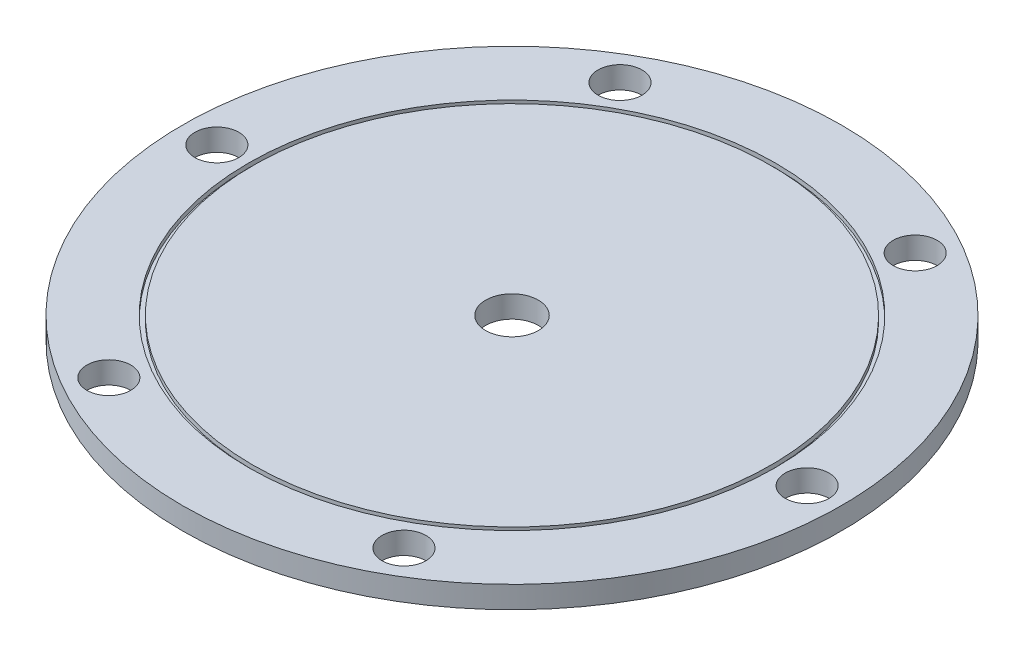
ISO-10303-21;
HEADER;
FILE_DESCRIPTION(('STEP AP214'),'2;1');
FILE_NAME('part.step','',(''),(''),'','','');
FILE_SCHEMA(('AUTOMOTIVE_DESIGN { 1 0 10303 214 1 1 1 1 }'));
ENDSEC;
DATA;
#1=APPLICATION_CONTEXT('core data for automotive mechanical design processes');
#2=APPLICATION_PROTOCOL_DEFINITION('international standard','automotive_design',2000,#1);
#3=PRODUCT_CONTEXT('',#1,'mechanical');
#4=PRODUCT('Part','Part','',(#3));
#5=PRODUCT_RELATED_PRODUCT_CATEGORY('part','',(#4));
#6=PRODUCT_DEFINITION_FORMATION('','',#4);
#7=PRODUCT_DEFINITION_CONTEXT('part definition',#1,'design');
#8=PRODUCT_DEFINITION('design','',#6,#7);
#9=PRODUCT_DEFINITION_SHAPE('','',#8);
#10=(LENGTH_UNIT() NAMED_UNIT(*) SI_UNIT(.MILLI.,.METRE.));
#11=(NAMED_UNIT(*) PLANE_ANGLE_UNIT() SI_UNIT($,.RADIAN.));
#12=(NAMED_UNIT(*) SI_UNIT($,.STERADIAN.) SOLID_ANGLE_UNIT());
#13=UNCERTAINTY_MEASURE_WITH_UNIT(LENGTH_MEASURE(1.E-05),#10,'distance_accuracy_value','');
#14=(GEOMETRIC_REPRESENTATION_CONTEXT(3) GLOBAL_UNCERTAINTY_ASSIGNED_CONTEXT((#13)) GLOBAL_UNIT_ASSIGNED_CONTEXT((#10,
#11,#12)) REPRESENTATION_CONTEXT('',''));
#15=CARTESIAN_POINT('',(0.,0.,0.));
#16=DIRECTION('',(0.,0.,1.));
#17=DIRECTION('',(1.,0.,0.));
#18=AXIS2_PLACEMENT_3D('',#15,#16,#17);
#19=CARTESIAN_POINT('',(0.,4.99999999999999,0.));
#20=DIRECTION('',(0.,-1.,0.));
#21=DIRECTION('',(0.,0.,-1.));
#22=AXIS2_PLACEMENT_3D('',#19,#20,#21);
#23=CYLINDRICAL_SURFACE('',#22,75.);
#24=CARTESIAN_POINT('',(0.,4.99999999999999,0.));
#25=DIRECTION('',(0.,1.,0.));
#26=DIRECTION('',(0.,0.,1.));
#27=AXIS2_PLACEMENT_3D('',#24,#25,#26);
#28=CIRCLE('',#27,75.);
#29=CARTESIAN_POINT('',(0.,4.99999999999999,75.));
#30=VERTEX_POINT('',#29);
#31=EDGE_CURVE('E10',#30,#30,#28,.T.);
#32=ORIENTED_EDGE('',*,*,#31,.F.);
#33=EDGE_LOOP('',(#32));
#34=FACE_BOUND('',#33,.T.);
#35=CARTESIAN_POINT('',(0.,0.,0.));
#36=DIRECTION('',(0.,1.,0.));
#37=DIRECTION('',(0.,0.,1.));
#38=AXIS2_PLACEMENT_3D('',#35,#36,#37);
#39=CIRCLE('',#38,75.);
#40=CARTESIAN_POINT('',(0.,0.,75.));
#41=VERTEX_POINT('',#40);
#42=EDGE_CURVE('E50',#41,#41,#39,.T.);
#43=ORIENTED_EDGE('',*,*,#42,.T.);
#44=EDGE_LOOP('',(#43));
#45=FACE_BOUND('',#44,.T.);
#46=ADVANCED_FACE('F42',(#34,#45),#23,.T.);
#47=CARTESIAN_POINT('',(0.,4.99999999999999,0.));
#48=DIRECTION('',(0.,1.,0.));
#49=DIRECTION('',(0.,0.,1.));
#50=AXIS2_PLACEMENT_3D('',#47,#48,#49);
#51=PLANE('',#50);
#52=CARTESIAN_POINT('',(-33.5835630555485,4.99999999999999,-58.1684375114016));
#53=DIRECTION('',(0.,1.,0.));
#54=DIRECTION('',(-0.866025403784433,0.,0.50000000000001));
#55=AXIS2_PLACEMENT_3D('',#52,#53,#54);
#56=CIRCLE('',#55,5.);
#57=CARTESIAN_POINT('',(-37.9136900744707,4.99999999999999,-55.6684375114015));
#58=VERTEX_POINT('',#57);
#59=EDGE_CURVE('E155',#58,#58,#56,.T.);
#60=ORIENTED_EDGE('',*,*,#59,.F.);
#61=EDGE_LOOP('',(#60));
#62=FACE_BOUND('',#61,.T.);
#63=CARTESIAN_POINT('',(33.5835630555473,4.99999999999999,-58.1684375114023));
#64=DIRECTION('',(0.,1.,0.));
#65=DIRECTION('',(-0.866025403784443,0.,-0.499999999999992));
#66=AXIS2_PLACEMENT_3D('',#63,#64,#65);
#67=CIRCLE('',#66,5.);
#68=CARTESIAN_POINT('',(29.2534360366251,4.99999999999999,-60.6684375114022));
#69=VERTEX_POINT('',#68);
#70=EDGE_CURVE('E166',#69,#69,#67,.T.);
#71=ORIENTED_EDGE('',*,*,#70,.F.);
#72=EDGE_LOOP('',(#71));
#73=FACE_BOUND('',#72,.T.);
#74=CARTESIAN_POINT('',(67.1671261110957,4.99999999999999,0.));
#75=DIRECTION('',(0.,1.,0.));
#76=DIRECTION('',(0.,0.,-1.));
#77=AXIS2_PLACEMENT_3D('',#74,#75,#76);
#78=CIRCLE('',#77,5.);
#79=CARTESIAN_POINT('',(67.1671261110957,4.99999999999999,-5.));
#80=VERTEX_POINT('',#79);
#81=EDGE_CURVE('E162',#80,#80,#78,.T.);
#82=ORIENTED_EDGE('',*,*,#81,.F.);
#83=EDGE_LOOP('',(#82));
#84=FACE_BOUND('',#83,.T.);
#85=CARTESIAN_POINT('',(33.5835630555481,4.99999999999999,58.1684375114018));
#86=DIRECTION('',(0.,1.,0.));
#87=DIRECTION('',(0.866025403784436,0.,-0.500000000000004));
#88=AXIS2_PLACEMENT_3D('',#85,#86,#87);
#89=CIRCLE('',#88,5.);
#90=CARTESIAN_POINT('',(37.9136900744703,4.99999999999999,55.6684375114018));
#91=VERTEX_POINT('',#90);
#92=EDGE_CURVE('E158',#91,#91,#89,.T.);
#93=ORIENTED_EDGE('',*,*,#92,.F.);
#94=EDGE_LOOP('',(#93));
#95=FACE_BOUND('',#94,.T.);
#96=CARTESIAN_POINT('',(-33.5835630555477,4.99999999999999,58.168437511402));
#97=DIRECTION('',(0.,1.,0.));
#98=DIRECTION('',(0.86602540378444,0.,0.499999999999998));
#99=AXIS2_PLACEMENT_3D('',#96,#97,#98);
#100=CIRCLE('',#99,5.);
#101=CARTESIAN_POINT('',(-29.2534360366255,4.99999999999999,60.668437511402));
#102=VERTEX_POINT('',#101);
#103=EDGE_CURVE('E73',#102,#102,#100,.T.);
#104=ORIENTED_EDGE('',*,*,#103,.F.);
#105=EDGE_LOOP('',(#104));
#106=FACE_BOUND('',#105,.T.);
#107=CARTESIAN_POINT('',(-67.1671261110957,4.99999999999999,0.));
#108=DIRECTION('',(0.,1.,0.));
#109=DIRECTION('',(0.,0.,1.));
#110=AXIS2_PLACEMENT_3D('',#107,#108,#109);
#111=CIRCLE('',#110,5.);
#112=CARTESIAN_POINT('',(-67.1671261110957,4.99999999999999,5.));
#113=VERTEX_POINT('',#112);
#114=EDGE_CURVE('E67',#113,#113,#111,.T.);
#115=ORIENTED_EDGE('',*,*,#114,.F.);
#116=EDGE_LOOP('',(#115));
#117=FACE_BOUND('',#116,.T.);
#118=CARTESIAN_POINT('',(0.,4.99999999999999,0.));
#119=DIRECTION('',(0.,1.,0.));
#120=DIRECTION('',(0.,0.,1.));
#121=AXIS2_PLACEMENT_3D('',#118,#119,#120);
#122=CIRCLE('',#121,60.);
#123=CARTESIAN_POINT('',(0.,4.99999999999999,60.));
#124=VERTEX_POINT('',#123);
#125=EDGE_CURVE('E59',#124,#124,#122,.T.);
#126=ORIENTED_EDGE('',*,*,#125,.F.);
#127=EDGE_LOOP('',(#126));
#128=FACE_BOUND('',#127,.T.);
#129=ORIENTED_EDGE('',*,*,#31,.T.);
#130=EDGE_LOOP('',(#129));
#131=FACE_BOUND('',#130,.T.);
#132=ADVANCED_FACE('F113',(#62,#73,#84,#95,#106,#117,#128,#131),#51,.T.);
#133=CARTESIAN_POINT('',(0.,0.,0.));
#134=DIRECTION('',(0.,1.,0.));
#135=DIRECTION('',(0.,0.,1.));
#136=AXIS2_PLACEMENT_3D('',#133,#134,#135);
#137=PLANE('',#136);
#138=CARTESIAN_POINT('',(0.,0.,0.));
#139=DIRECTION('',(0.,1.,0.));
#140=DIRECTION('',(0.,0.,1.));
#141=AXIS2_PLACEMENT_3D('',#138,#139,#140);
#142=CIRCLE('',#141,6.);
#143=CARTESIAN_POINT('',(0.,0.,6.));
#144=VERTEX_POINT('',#143);
#145=EDGE_CURVE('E151',#144,#144,#142,.T.);
#146=ORIENTED_EDGE('',*,*,#145,.T.);
#147=EDGE_LOOP('',(#146));
#148=FACE_BOUND('',#147,.T.);
#149=CARTESIAN_POINT('',(-33.5835630555485,0.,-58.1684375114016));
#150=DIRECTION('',(0.,1.,0.));
#151=DIRECTION('',(0.,0.,1.));
#152=AXIS2_PLACEMENT_3D('',#149,#150,#151);
#153=CIRCLE('',#152,5.);
#154=CARTESIAN_POINT('',(-33.5835630555485,0.,-53.1684375114016));
#155=VERTEX_POINT('',#154);
#156=EDGE_CURVE('E45',#155,#155,#153,.T.);
#157=ORIENTED_EDGE('',*,*,#156,.T.);
#158=EDGE_LOOP('',(#157));
#159=FACE_BOUND('',#158,.T.);
#160=CARTESIAN_POINT('',(33.5835630555473,0.,-58.1684375114023));
#161=DIRECTION('',(0.,1.,0.));
#162=DIRECTION('',(0.,0.,1.));
#163=AXIS2_PLACEMENT_3D('',#160,#161,#162);
#164=CIRCLE('',#163,5.);
#165=CARTESIAN_POINT('',(33.5835630555473,0.,-53.1684375114023));
#166=VERTEX_POINT('',#165);
#167=EDGE_CURVE('E80',#166,#166,#164,.T.);
#168=ORIENTED_EDGE('',*,*,#167,.T.);
#169=EDGE_LOOP('',(#168));
#170=FACE_BOUND('',#169,.T.);
#171=CARTESIAN_POINT('',(67.1671261110957,0.,0.));
#172=DIRECTION('',(0.,1.,0.));
#173=DIRECTION('',(0.,0.,1.));
#174=AXIS2_PLACEMENT_3D('',#171,#172,#173);
#175=CIRCLE('',#174,5.);
#176=CARTESIAN_POINT('',(67.1671261110957,0.,5.));
#177=VERTEX_POINT('',#176);
#178=EDGE_CURVE('E77',#177,#177,#175,.T.);
#179=ORIENTED_EDGE('',*,*,#178,.T.);
#180=EDGE_LOOP('',(#179));
#181=FACE_BOUND('',#180,.T.);
#182=CARTESIAN_POINT('',(33.5835630555481,0.,58.1684375114018));
#183=DIRECTION('',(0.,1.,0.));
#184=DIRECTION('',(0.,0.,1.));
#185=AXIS2_PLACEMENT_3D('',#182,#183,#184);
#186=CIRCLE('',#185,5.);
#187=CARTESIAN_POINT('',(33.5835630555481,0.,63.1684375114018));
#188=VERTEX_POINT('',#187);
#189=EDGE_CURVE('E72',#188,#188,#186,.T.);
#190=ORIENTED_EDGE('',*,*,#189,.T.);
#191=EDGE_LOOP('',(#190));
#192=FACE_BOUND('',#191,.T.);
#193=CARTESIAN_POINT('',(-33.5835630555477,0.,58.168437511402));
#194=DIRECTION('',(0.,1.,0.));
#195=DIRECTION('',(0.,0.,1.));
#196=AXIS2_PLACEMENT_3D('',#193,#194,#195);
#197=CIRCLE('',#196,5.);
#198=CARTESIAN_POINT('',(-33.5835630555477,0.,63.168437511402));
#199=VERTEX_POINT('',#198);
#200=EDGE_CURVE('E68',#199,#199,#197,.T.);
#201=ORIENTED_EDGE('',*,*,#200,.T.);
#202=EDGE_LOOP('',(#201));
#203=FACE_BOUND('',#202,.T.);
#204=CARTESIAN_POINT('',(-67.1671261110957,0.,0.));
#205=DIRECTION('',(0.,1.,0.));
#206=DIRECTION('',(0.,0.,1.));
#207=AXIS2_PLACEMENT_3D('',#204,#205,#206);
#208=CIRCLE('',#207,5.);
#209=CARTESIAN_POINT('',(-67.1671261110957,0.,5.));
#210=VERTEX_POINT('',#209);
#211=EDGE_CURVE('E62',#210,#210,#208,.T.);
#212=ORIENTED_EDGE('',*,*,#211,.T.);
#213=EDGE_LOOP('',(#212));
#214=FACE_BOUND('',#213,.T.);
#215=ORIENTED_EDGE('',*,*,#42,.F.);
#216=EDGE_LOOP('',(#215));
#217=FACE_BOUND('',#216,.T.);
#218=ADVANCED_FACE('F115',(#148,#159,#170,#181,#192,#203,#214,#217),#137,.F.);
#219=CARTESIAN_POINT('',(0.,3.99999999999999,0.));
#220=DIRECTION('',(0.,1.,0.));
#221=DIRECTION('',(0.,0.,1.));
#222=AXIS2_PLACEMENT_3D('',#219,#220,#221);
#223=CYLINDRICAL_SURFACE('',#222,60.);
#224=CARTESIAN_POINT('',(0.,3.99999999999999,0.));
#225=DIRECTION('',(0.,1.,0.));
#226=DIRECTION('',(0.,0.,1.));
#227=AXIS2_PLACEMENT_3D('',#224,#225,#226);
#228=CIRCLE('',#227,60.);
#229=CARTESIAN_POINT('',(0.,3.99999999999999,60.));
#230=VERTEX_POINT('',#229);
#231=EDGE_CURVE('E56',#230,#230,#228,.T.);
#232=ORIENTED_EDGE('',*,*,#231,.F.);
#233=EDGE_LOOP('',(#232));
#234=FACE_BOUND('',#233,.T.);
#235=ORIENTED_EDGE('',*,*,#125,.T.);
#236=EDGE_LOOP('',(#235));
#237=FACE_BOUND('',#236,.T.);
#238=ADVANCED_FACE('F111',(#234,#237),#223,.F.);
#239=CARTESIAN_POINT('',(0.,3.99999999999999,0.));
#240=DIRECTION('',(0.,1.,0.));
#241=DIRECTION('',(0.,0.,1.));
#242=AXIS2_PLACEMENT_3D('',#239,#240,#241);
#243=PLANE('',#242);
#244=CARTESIAN_POINT('',(0.,3.99999999999999,0.));
#245=DIRECTION('',(0.,1.,0.));
#246=DIRECTION('',(0.,0.,1.));
#247=AXIS2_PLACEMENT_3D('',#244,#245,#246);
#248=CIRCLE('',#247,59.);
#249=CARTESIAN_POINT('',(0.,3.99999999999999,59.));
#250=VERTEX_POINT('',#249);
#251=EDGE_CURVE('E97',#250,#250,#248,.T.);
#252=ORIENTED_EDGE('',*,*,#251,.F.);
#253=EDGE_LOOP('',(#252));
#254=FACE_BOUND('',#253,.T.);
#255=ORIENTED_EDGE('',*,*,#231,.T.);
#256=EDGE_LOOP('',(#255));
#257=FACE_BOUND('',#256,.T.);
#258=ADVANCED_FACE('F140',(#254,#257),#243,.T.);
#259=CARTESIAN_POINT('',(0.,3.99999999999999,0.));
#260=DIRECTION('',(0.,1.,0.));
#261=DIRECTION('',(0.,0.,1.));
#262=AXIS2_PLACEMENT_3D('',#259,#260,#261);
#263=CYLINDRICAL_SURFACE('',#262,59.);
#264=ORIENTED_EDGE('',*,*,#251,.T.);
#265=EDGE_LOOP('',(#264));
#266=FACE_BOUND('',#265,.T.);
#267=CARTESIAN_POINT('',(0.,4.99999999999999,0.));
#268=DIRECTION('',(0.,1.,0.));
#269=DIRECTION('',(0.,0.,1.));
#270=AXIS2_PLACEMENT_3D('',#267,#268,#269);
#271=CIRCLE('',#270,59.);
#272=CARTESIAN_POINT('',(0.,4.99999999999999,59.));
#273=VERTEX_POINT('',#272);
#274=EDGE_CURVE('E66',#273,#273,#271,.T.);
#275=ORIENTED_EDGE('',*,*,#274,.F.);
#276=EDGE_LOOP('',(#275));
#277=FACE_BOUND('',#276,.T.);
#278=ADVANCED_FACE('F132',(#266,#277),#263,.T.);
#279=CARTESIAN_POINT('',(0.,4.99999999999999,0.));
#280=DIRECTION('',(0.,1.,0.));
#281=DIRECTION('',(0.,0.,1.));
#282=AXIS2_PLACEMENT_3D('',#279,#280,#281);
#283=CIRCLE('',#282,6.);
#284=CARTESIAN_POINT('',(0.,4.99999999999999,6.));
#285=VERTEX_POINT('',#284);
#286=EDGE_CURVE('E146',#285,#285,#283,.T.);
#287=ORIENTED_EDGE('',*,*,#286,.F.);
#288=EDGE_LOOP('',(#287));
#289=FACE_BOUND('',#288,.T.);
#290=ORIENTED_EDGE('',*,*,#274,.T.);
#291=EDGE_LOOP('',(#290));
#292=FACE_BOUND('',#291,.T.);
#293=ADVANCED_FACE('F118',(#289,#292),#51,.T.);
#294=CARTESIAN_POINT('',(-67.1671261110957,-156.,0.));
#295=DIRECTION('',(0.,1.,0.));
#296=DIRECTION('',(0.,0.,1.));
#297=AXIS2_PLACEMENT_3D('',#294,#295,#296);
#298=CYLINDRICAL_SURFACE('',#297,5.);
#299=ORIENTED_EDGE('',*,*,#114,.T.);
#300=EDGE_LOOP('',(#299));
#301=FACE_BOUND('',#300,.T.);
#302=ORIENTED_EDGE('',*,*,#211,.F.);
#303=EDGE_LOOP('',(#302));
#304=FACE_BOUND('',#303,.T.);
#305=ADVANCED_FACE('F131',(#301,#304),#298,.F.);
#306=CARTESIAN_POINT('',(-33.5835630555477,-156.,58.168437511402));
#307=DIRECTION('',(0.,1.,0.));
#308=DIRECTION('',(0.,0.,1.));
#309=AXIS2_PLACEMENT_3D('',#306,#307,#308);
#310=CYLINDRICAL_SURFACE('',#309,5.);
#311=ORIENTED_EDGE('',*,*,#103,.T.);
#312=EDGE_LOOP('',(#311));
#313=FACE_BOUND('',#312,.T.);
#314=ORIENTED_EDGE('',*,*,#200,.F.);
#315=EDGE_LOOP('',(#314));
#316=FACE_BOUND('',#315,.T.);
#317=ADVANCED_FACE('F137',(#313,#316),#310,.F.);
#318=CARTESIAN_POINT('',(33.5835630555481,-156.,58.1684375114018));
#319=DIRECTION('',(0.,1.,0.));
#320=DIRECTION('',(0.,0.,1.));
#321=AXIS2_PLACEMENT_3D('',#318,#319,#320);
#322=CYLINDRICAL_SURFACE('',#321,5.);
#323=ORIENTED_EDGE('',*,*,#92,.T.);
#324=EDGE_LOOP('',(#323));
#325=FACE_BOUND('',#324,.T.);
#326=ORIENTED_EDGE('',*,*,#189,.F.);
#327=EDGE_LOOP('',(#326));
#328=FACE_BOUND('',#327,.T.);
#329=ADVANCED_FACE('F187',(#325,#328),#322,.F.);
#330=CARTESIAN_POINT('',(67.1671261110957,-156.,0.));
#331=DIRECTION('',(0.,1.,0.));
#332=DIRECTION('',(0.,0.,1.));
#333=AXIS2_PLACEMENT_3D('',#330,#331,#332);
#334=CYLINDRICAL_SURFACE('',#333,5.);
#335=ORIENTED_EDGE('',*,*,#81,.T.);
#336=EDGE_LOOP('',(#335));
#337=FACE_BOUND('',#336,.T.);
#338=ORIENTED_EDGE('',*,*,#178,.F.);
#339=EDGE_LOOP('',(#338));
#340=FACE_BOUND('',#339,.T.);
#341=ADVANCED_FACE('F182',(#337,#340),#334,.F.);
#342=CARTESIAN_POINT('',(33.5835630555473,-156.,-58.1684375114023));
#343=DIRECTION('',(0.,1.,0.));
#344=DIRECTION('',(0.,0.,1.));
#345=AXIS2_PLACEMENT_3D('',#342,#343,#344);
#346=CYLINDRICAL_SURFACE('',#345,5.);
#347=ORIENTED_EDGE('',*,*,#70,.T.);
#348=EDGE_LOOP('',(#347));
#349=FACE_BOUND('',#348,.T.);
#350=ORIENTED_EDGE('',*,*,#167,.F.);
#351=EDGE_LOOP('',(#350));
#352=FACE_BOUND('',#351,.T.);
#353=ADVANCED_FACE('F176',(#349,#352),#346,.F.);
#354=CARTESIAN_POINT('',(-33.5835630555485,-156.,-58.1684375114016));
#355=DIRECTION('',(0.,1.,0.));
#356=DIRECTION('',(0.,0.,1.));
#357=AXIS2_PLACEMENT_3D('',#354,#355,#356);
#358=CYLINDRICAL_SURFACE('',#357,5.);
#359=ORIENTED_EDGE('',*,*,#59,.T.);
#360=EDGE_LOOP('',(#359));
#361=FACE_BOUND('',#360,.T.);
#362=ORIENTED_EDGE('',*,*,#156,.F.);
#363=EDGE_LOOP('',(#362));
#364=FACE_BOUND('',#363,.T.);
#365=ADVANCED_FACE('F172',(#361,#364),#358,.F.);
#366=CARTESIAN_POINT('',(0.,-5.00000000000001,0.));
#367=DIRECTION('',(0.,1.,0.));
#368=DIRECTION('',(0.,0.,1.));
#369=AXIS2_PLACEMENT_3D('',#366,#367,#368);
#370=CYLINDRICAL_SURFACE('',#369,6.);
#371=ORIENTED_EDGE('',*,*,#286,.T.);
#372=EDGE_LOOP('',(#371));
#373=FACE_BOUND('',#372,.T.);
#374=ORIENTED_EDGE('',*,*,#145,.F.);
#375=EDGE_LOOP('',(#374));
#376=FACE_BOUND('',#375,.T.);
#377=ADVANCED_FACE('F175',(#373,#376),#370,.F.);
#378=CLOSED_SHELL('',(#46,#132,#218,#238,#258,#278,#293,#305,#317,#329,#341,#353,#365,#377));
#379=MANIFOLD_SOLID_BREP('B2',#378);
#380=ADVANCED_BREP_SHAPE_REPRESENTATION('',(#18,#379),#14);
#381=SHAPE_DEFINITION_REPRESENTATION(#9,#380);
ENDSEC;
END-ISO-10303-21;
